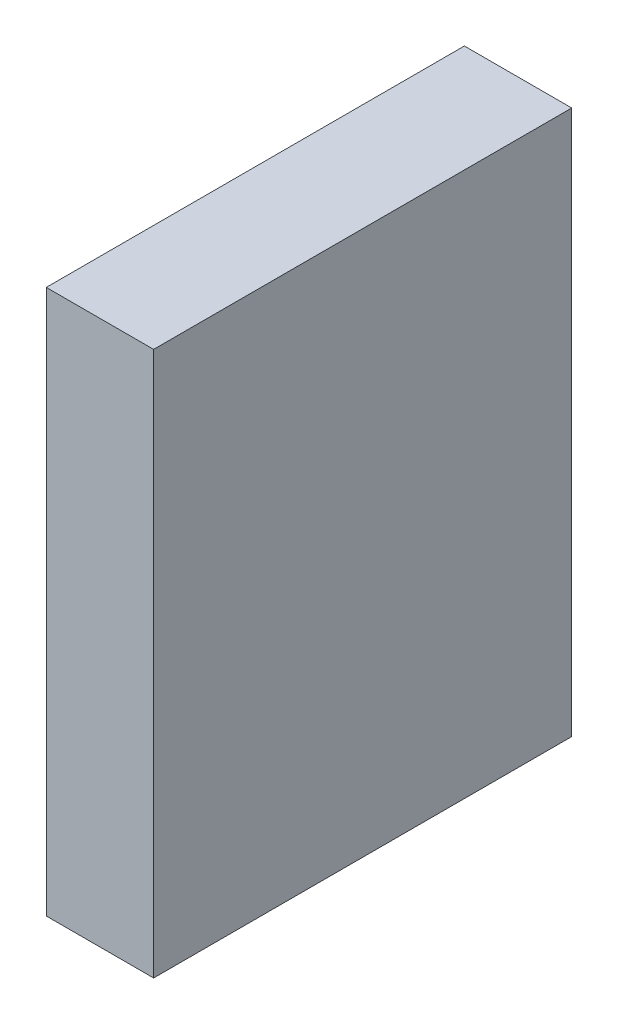
ISO-10303-21;
HEADER;
FILE_DESCRIPTION(('STEP AP214'),'2;1');
FILE_NAME('part.step','',(''),(''),'','','');
FILE_SCHEMA(('AUTOMOTIVE_DESIGN { 1 0 10303 214 1 1 1 1 }'));
ENDSEC;
DATA;
#1=APPLICATION_CONTEXT('core data for automotive mechanical design processes');
#2=APPLICATION_PROTOCOL_DEFINITION('international standard','automotive_design',2000,#1);
#3=PRODUCT_CONTEXT('',#1,'mechanical');
#4=PRODUCT('Part','Part','',(#3));
#5=PRODUCT_RELATED_PRODUCT_CATEGORY('part','',(#4));
#6=PRODUCT_DEFINITION_FORMATION('','',#4);
#7=PRODUCT_DEFINITION_CONTEXT('part definition',#1,'design');
#8=PRODUCT_DEFINITION('design','',#6,#7);
#9=PRODUCT_DEFINITION_SHAPE('','',#8);
#10=(LENGTH_UNIT() NAMED_UNIT(*) SI_UNIT(.MILLI.,.METRE.));
#11=(NAMED_UNIT(*) PLANE_ANGLE_UNIT() SI_UNIT($,.RADIAN.));
#12=(NAMED_UNIT(*) SI_UNIT($,.STERADIAN.) SOLID_ANGLE_UNIT());
#13=UNCERTAINTY_MEASURE_WITH_UNIT(LENGTH_MEASURE(1.E-05),#10,'distance_accuracy_value','');
#14=(GEOMETRIC_REPRESENTATION_CONTEXT(3) GLOBAL_UNCERTAINTY_ASSIGNED_CONTEXT((#13)) GLOBAL_UNIT_ASSIGNED_CONTEXT((#10,
#11,#12)) REPRESENTATION_CONTEXT('',''));
#15=CARTESIAN_POINT('',(0.,0.,0.));
#16=DIRECTION('',(0.,0.,1.));
#17=DIRECTION('',(1.,0.,0.));
#18=AXIS2_PLACEMENT_3D('',#15,#16,#17);
#19=CARTESIAN_POINT('',(5.21,-13.21,-10.145));
#20=DIRECTION('',(0.,0.,1.));
#21=DIRECTION('',(1.,0.,0.));
#22=AXIS2_PLACEMENT_3D('',#19,#20,#21);
#23=PLANE('',#22);
#24=DIRECTION('',(0.,1.,0.));
#25=VECTOR('',#24,1.);
#26=CARTESIAN_POINT('',(0.,-13.21,-10.145));
#27=LINE('',#26,#25);
#28=CARTESIAN_POINT('',(0.,-13.21,-10.145));
#29=VERTEX_POINT('',#28);
#30=CARTESIAN_POINT('',(0.,13.21,-10.145));
#31=VERTEX_POINT('',#30);
#32=EDGE_CURVE('E96',#29,#31,#27,.T.);
#33=ORIENTED_EDGE('',*,*,#32,.T.);
#34=DIRECTION('',(-1.,0.,0.));
#35=VECTOR('',#34,1.);
#36=CARTESIAN_POINT('',(5.21,13.21,-10.145));
#37=LINE('',#36,#35);
#38=CARTESIAN_POINT('',(5.21,13.21,-10.145));
#39=VERTEX_POINT('',#38);
#40=EDGE_CURVE('E11',#39,#31,#37,.T.);
#41=ORIENTED_EDGE('',*,*,#40,.F.);
#42=DIRECTION('',(0.,1.,0.));
#43=VECTOR('',#42,1.);
#44=CARTESIAN_POINT('',(5.21,-13.21,-10.145));
#45=LINE('',#44,#43);
#46=CARTESIAN_POINT('',(5.21,-13.21,-10.145));
#47=VERTEX_POINT('',#46);
#48=EDGE_CURVE('E84',#47,#39,#45,.T.);
#49=ORIENTED_EDGE('',*,*,#48,.F.);
#50=DIRECTION('',(-1.,0.,0.));
#51=VECTOR('',#50,1.);
#52=CARTESIAN_POINT('',(5.21,-13.21,-10.145));
#53=LINE('',#52,#51);
#54=EDGE_CURVE('E92',#47,#29,#53,.T.);
#55=ORIENTED_EDGE('',*,*,#54,.T.);
#56=EDGE_LOOP('',(#33,#41,#49,#55));
#57=FACE_BOUND('',#56,.T.);
#58=ADVANCED_FACE('F33',(#57),#23,.F.);
#59=CARTESIAN_POINT('',(5.21,13.21,10.145));
#60=DIRECTION('',(0.,-1.,0.));
#61=DIRECTION('',(0.,0.,-1.));
#62=AXIS2_PLACEMENT_3D('',#59,#60,#61);
#63=PLANE('',#62);
#64=DIRECTION('',(0.,0.,1.));
#65=VECTOR('',#64,1.);
#66=CARTESIAN_POINT('',(0.,13.21,10.145));
#67=LINE('',#66,#65);
#68=CARTESIAN_POINT('',(0.,13.21,10.145));
#69=VERTEX_POINT('',#68);
#70=EDGE_CURVE('E88',#31,#69,#67,.T.);
#71=ORIENTED_EDGE('',*,*,#70,.T.);
#72=DIRECTION('',(-1.,0.,0.));
#73=VECTOR('',#72,1.);
#74=CARTESIAN_POINT('',(5.21,13.21,10.145));
#75=LINE('',#74,#73);
#76=CARTESIAN_POINT('',(5.21,13.21,10.145));
#77=VERTEX_POINT('',#76);
#78=EDGE_CURVE('E41',#77,#69,#75,.T.);
#79=ORIENTED_EDGE('',*,*,#78,.F.);
#80=DIRECTION('',(0.,0.,1.));
#81=VECTOR('',#80,1.);
#82=CARTESIAN_POINT('',(5.21,13.21,10.145));
#83=LINE('',#82,#81);
#84=EDGE_CURVE('E79',#39,#77,#83,.T.);
#85=ORIENTED_EDGE('',*,*,#84,.F.);
#86=ORIENTED_EDGE('',*,*,#40,.T.);
#87=EDGE_LOOP('',(#71,#79,#85,#86));
#88=FACE_BOUND('',#87,.T.);
#89=ADVANCED_FACE('F87',(#88),#63,.F.);
#90=CARTESIAN_POINT('',(5.21,-13.21,10.145));
#91=DIRECTION('',(0.,0.,-1.));
#92=DIRECTION('',(-1.,0.,0.));
#93=AXIS2_PLACEMENT_3D('',#90,#91,#92);
#94=PLANE('',#93);
#95=DIRECTION('',(0.,-1.,0.));
#96=VECTOR('',#95,1.);
#97=CARTESIAN_POINT('',(0.,-13.21,10.145));
#98=LINE('',#97,#96);
#99=CARTESIAN_POINT('',(0.,-13.21,10.145));
#100=VERTEX_POINT('',#99);
#101=EDGE_CURVE('E66',#69,#100,#98,.T.);
#102=ORIENTED_EDGE('',*,*,#101,.T.);
#103=DIRECTION('',(-1.,0.,0.));
#104=VECTOR('',#103,1.);
#105=CARTESIAN_POINT('',(5.21,-13.21,10.145));
#106=LINE('',#105,#104);
#107=CARTESIAN_POINT('',(5.21,-13.21,10.145));
#108=VERTEX_POINT('',#107);
#109=EDGE_CURVE('E89',#108,#100,#106,.T.);
#110=ORIENTED_EDGE('',*,*,#109,.F.);
#111=DIRECTION('',(0.,-1.,0.));
#112=VECTOR('',#111,1.);
#113=CARTESIAN_POINT('',(5.21,-13.21,10.145));
#114=LINE('',#113,#112);
#115=EDGE_CURVE('E82',#77,#108,#114,.T.);
#116=ORIENTED_EDGE('',*,*,#115,.F.);
#117=ORIENTED_EDGE('',*,*,#78,.T.);
#118=EDGE_LOOP('',(#102,#110,#116,#117));
#119=FACE_BOUND('',#118,.T.);
#120=ADVANCED_FACE('F90',(#119),#94,.F.);
#121=CARTESIAN_POINT('',(5.21,-13.21,10.145));
#122=DIRECTION('',(0.,1.,0.));
#123=DIRECTION('',(0.,0.,1.));
#124=AXIS2_PLACEMENT_3D('',#121,#122,#123);
#125=PLANE('',#124);
#126=DIRECTION('',(0.,0.,-1.));
#127=VECTOR('',#126,1.);
#128=CARTESIAN_POINT('',(0.,-13.21,10.145));
#129=LINE('',#128,#127);
#130=EDGE_CURVE('E72',#100,#29,#129,.T.);
#131=ORIENTED_EDGE('',*,*,#130,.T.);
#132=ORIENTED_EDGE('',*,*,#54,.F.);
#133=DIRECTION('',(0.,0.,-1.));
#134=VECTOR('',#133,1.);
#135=CARTESIAN_POINT('',(5.21,-13.21,10.145));
#136=LINE('',#135,#134);
#137=EDGE_CURVE('E49',#108,#47,#136,.T.);
#138=ORIENTED_EDGE('',*,*,#137,.F.);
#139=ORIENTED_EDGE('',*,*,#109,.T.);
#140=EDGE_LOOP('',(#131,#132,#138,#139));
#141=FACE_BOUND('',#140,.T.);
#142=ADVANCED_FACE('F103',(#141),#125,.F.);
#143=CARTESIAN_POINT('',(5.21,0.,0.));
#144=DIRECTION('',(-1.,0.,0.));
#145=DIRECTION('',(0.,0.,1.));
#146=AXIS2_PLACEMENT_3D('',#143,#144,#145);
#147=PLANE('',#146);
#148=ORIENTED_EDGE('',*,*,#48,.T.);
#149=ORIENTED_EDGE('',*,*,#84,.T.);
#150=ORIENTED_EDGE('',*,*,#115,.T.);
#151=ORIENTED_EDGE('',*,*,#137,.T.);
#152=EDGE_LOOP('',(#148,#149,#150,#151));
#153=FACE_BOUND('',#152,.T.);
#154=ADVANCED_FACE('F80',(#153),#147,.F.);
#155=CARTESIAN_POINT('',(0.,0.,0.));
#156=DIRECTION('',(-1.,0.,0.));
#157=DIRECTION('',(0.,0.,1.));
#158=AXIS2_PLACEMENT_3D('',#155,#156,#157);
#159=PLANE('',#158);
#160=ORIENTED_EDGE('',*,*,#32,.F.);
#161=ORIENTED_EDGE('',*,*,#130,.F.);
#162=ORIENTED_EDGE('',*,*,#101,.F.);
#163=ORIENTED_EDGE('',*,*,#70,.F.);
#164=EDGE_LOOP('',(#160,#161,#162,#163));
#165=FACE_BOUND('',#164,.T.);
#166=ADVANCED_FACE('F106',(#165),#159,.T.);
#167=CLOSED_SHELL('',(#58,#89,#120,#142,#154,#166));
#168=MANIFOLD_SOLID_BREP('B2',#167);
#169=ADVANCED_BREP_SHAPE_REPRESENTATION('',(#18,#168),#14);
#170=SHAPE_DEFINITION_REPRESENTATION(#9,#169);
ENDSEC;
END-ISO-10303-21;
